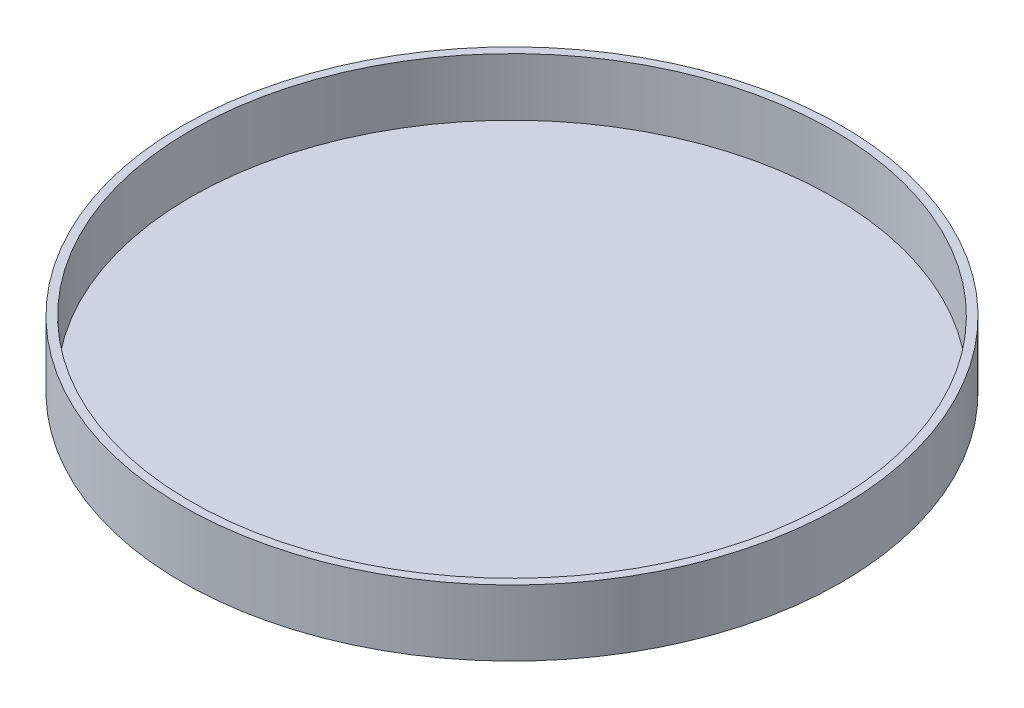
ISO-10303-21;
HEADER;
FILE_DESCRIPTION(('STEP AP214'),'2;1');
FILE_NAME('part.step','',(''),(''),'','','');
FILE_SCHEMA(('AUTOMOTIVE_DESIGN { 1 0 10303 214 1 1 1 1 }'));
ENDSEC;
DATA;
#1=APPLICATION_CONTEXT('core data for automotive mechanical design processes');
#2=APPLICATION_PROTOCOL_DEFINITION('international standard','automotive_design',2000,#1);
#3=PRODUCT_CONTEXT('',#1,'mechanical');
#4=PRODUCT('Part','Part','',(#3));
#5=PRODUCT_RELATED_PRODUCT_CATEGORY('part','',(#4));
#6=PRODUCT_DEFINITION_FORMATION('','',#4);
#7=PRODUCT_DEFINITION_CONTEXT('part definition',#1,'design');
#8=PRODUCT_DEFINITION('design','',#6,#7);
#9=PRODUCT_DEFINITION_SHAPE('','',#8);
#10=(LENGTH_UNIT() NAMED_UNIT(*) SI_UNIT(.MILLI.,.METRE.));
#11=(NAMED_UNIT(*) PLANE_ANGLE_UNIT() SI_UNIT($,.RADIAN.));
#12=(NAMED_UNIT(*) SI_UNIT($,.STERADIAN.) SOLID_ANGLE_UNIT());
#13=UNCERTAINTY_MEASURE_WITH_UNIT(LENGTH_MEASURE(1.E-05),#10,'distance_accuracy_value','');
#14=(GEOMETRIC_REPRESENTATION_CONTEXT(3) GLOBAL_UNCERTAINTY_ASSIGNED_CONTEXT((#13)) GLOBAL_UNIT_ASSIGNED_CONTEXT((#10,
#11,#12)) REPRESENTATION_CONTEXT('',''));
#15=CARTESIAN_POINT('',(0.,0.,0.));
#16=DIRECTION('',(0.,0.,1.));
#17=DIRECTION('',(1.,0.,0.));
#18=AXIS2_PLACEMENT_3D('',#15,#16,#17);
#19=CARTESIAN_POINT('',(0.,0.,0.));
#20=DIRECTION('',(0.,1.,0.));
#21=DIRECTION('',(-1.,0.,0.));
#22=AXIS2_PLACEMENT_3D('',#19,#20,#21);
#23=PLANE('',#22);
#24=CARTESIAN_POINT('',(0.,0.,0.));
#25=DIRECTION('',(0.,1.,0.));
#26=DIRECTION('',(-1.,0.,0.));
#27=AXIS2_PLACEMENT_3D('',#24,#25,#26);
#28=CIRCLE('',#27,200.);
#29=CARTESIAN_POINT('',(-200.,0.,0.));
#30=VERTEX_POINT('',#29);
#31=EDGE_CURVE('E10',#30,#30,#28,.T.);
#32=ORIENTED_EDGE('',*,*,#31,.F.);
#33=EDGE_LOOP('',(#32));
#34=FACE_BOUND('',#33,.T.);
#35=ADVANCED_FACE('F36',(#34),#23,.F.);
#36=CARTESIAN_POINT('',(0.,5.,0.));
#37=DIRECTION('',(0.,1.,0.));
#38=DIRECTION('',(-1.,0.,0.));
#39=AXIS2_PLACEMENT_3D('',#36,#37,#38);
#40=CYLINDRICAL_SURFACE('',#39,200.);
#41=CARTESIAN_POINT('',(0.,40.,0.));
#42=DIRECTION('',(0.,1.,0.));
#43=DIRECTION('',(-1.,0.,0.));
#44=AXIS2_PLACEMENT_3D('',#41,#42,#43);
#45=CIRCLE('',#44,200.);
#46=CARTESIAN_POINT('',(-200.,40.0000000000001,0.));
#47=VERTEX_POINT('',#46);
#48=EDGE_CURVE('E42',#47,#47,#45,.T.);
#49=ORIENTED_EDGE('',*,*,#48,.F.);
#50=EDGE_LOOP('',(#49));
#51=FACE_BOUND('',#50,.T.);
#52=ORIENTED_EDGE('',*,*,#31,.T.);
#53=EDGE_LOOP('',(#52));
#54=FACE_BOUND('',#53,.T.);
#55=ADVANCED_FACE('F66',(#51,#54),#40,.T.);
#56=CARTESIAN_POINT('',(200.,40.,0.));
#57=DIRECTION('',(0.,-1.,0.));
#58=DIRECTION('',(1.,0.,0.));
#59=AXIS2_PLACEMENT_3D('',#56,#57,#58);
#60=PLANE('',#59);
#61=CARTESIAN_POINT('',(0.,40.,0.));
#62=DIRECTION('',(0.,1.,0.));
#63=DIRECTION('',(-1.,0.,0.));
#64=AXIS2_PLACEMENT_3D('',#61,#62,#63);
#65=CIRCLE('',#64,195.);
#66=CARTESIAN_POINT('',(-195.,40.0000000000001,0.));
#67=VERTEX_POINT('',#66);
#68=EDGE_CURVE('E46',#67,#67,#65,.T.);
#69=ORIENTED_EDGE('',*,*,#68,.F.);
#70=EDGE_LOOP('',(#69));
#71=FACE_BOUND('',#70,.T.);
#72=ORIENTED_EDGE('',*,*,#48,.T.);
#73=EDGE_LOOP('',(#72));
#74=FACE_BOUND('',#73,.T.);
#75=ADVANCED_FACE('F61',(#71,#74),#60,.F.);
#76=CARTESIAN_POINT('',(0.,5.,0.));
#77=DIRECTION('',(0.,1.,0.));
#78=DIRECTION('',(-1.,0.,0.));
#79=AXIS2_PLACEMENT_3D('',#76,#77,#78);
#80=CYLINDRICAL_SURFACE('',#79,195.);
#81=CARTESIAN_POINT('',(0.,5.00000000000006,0.));
#82=DIRECTION('',(0.,1.,0.));
#83=DIRECTION('',(-1.,0.,0.));
#84=AXIS2_PLACEMENT_3D('',#81,#82,#83);
#85=CIRCLE('',#84,195.);
#86=CARTESIAN_POINT('',(-195.,5.0000000000001,0.));
#87=VERTEX_POINT('',#86);
#88=EDGE_CURVE('E50',#87,#87,#85,.T.);
#89=ORIENTED_EDGE('',*,*,#88,.F.);
#90=EDGE_LOOP('',(#89));
#91=FACE_BOUND('',#90,.T.);
#92=ORIENTED_EDGE('',*,*,#68,.T.);
#93=EDGE_LOOP('',(#92));
#94=FACE_BOUND('',#93,.T.);
#95=ADVANCED_FACE('F58',(#91,#94),#80,.F.);
#96=CARTESIAN_POINT('',(195.,4.99999999999999,0.));
#97=DIRECTION('',(0.,-1.,0.));
#98=DIRECTION('',(1.,0.,0.));
#99=AXIS2_PLACEMENT_3D('',#96,#97,#98);
#100=PLANE('',#99);
#101=ORIENTED_EDGE('',*,*,#88,.T.);
#102=EDGE_LOOP('',(#101));
#103=FACE_BOUND('',#102,.T.);
#104=ADVANCED_FACE('F56',(#103),#100,.F.);
#105=CLOSED_SHELL('',(#35,#55,#75,#95,#104));
#106=MANIFOLD_SOLID_BREP('B2',#105);
#107=ADVANCED_BREP_SHAPE_REPRESENTATION('',(#18,#106),#14);
#108=SHAPE_DEFINITION_REPRESENTATION(#9,#107);
ENDSEC;
END-ISO-10303-21;
